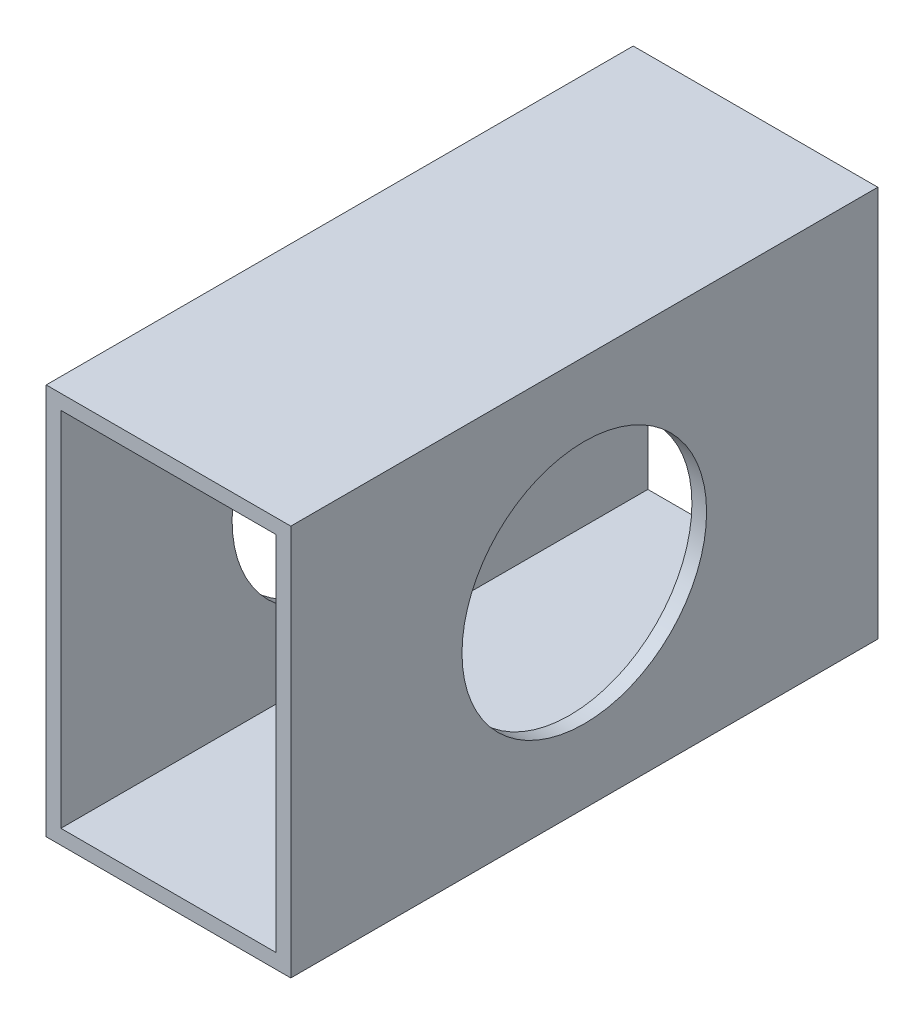
ISO-10303-21;
HEADER;
FILE_DESCRIPTION(('STEP AP214'),'2;1');
FILE_NAME('part.step','',(''),(''),'','','');
FILE_SCHEMA(('AUTOMOTIVE_DESIGN { 1 0 10303 214 1 1 1 1 }'));
ENDSEC;
DATA;
#1=APPLICATION_CONTEXT('core data for automotive mechanical design processes');
#2=APPLICATION_PROTOCOL_DEFINITION('international standard','automotive_design',2000,#1);
#3=PRODUCT_CONTEXT('',#1,'mechanical');
#4=PRODUCT('Part','Part','',(#3));
#5=PRODUCT_RELATED_PRODUCT_CATEGORY('part','',(#4));
#6=PRODUCT_DEFINITION_FORMATION('','',#4);
#7=PRODUCT_DEFINITION_CONTEXT('part definition',#1,'design');
#8=PRODUCT_DEFINITION('design','',#6,#7);
#9=PRODUCT_DEFINITION_SHAPE('','',#8);
#10=(LENGTH_UNIT() NAMED_UNIT(*) SI_UNIT(.MILLI.,.METRE.));
#11=(NAMED_UNIT(*) PLANE_ANGLE_UNIT() SI_UNIT($,.RADIAN.));
#12=(NAMED_UNIT(*) SI_UNIT($,.STERADIAN.) SOLID_ANGLE_UNIT());
#13=UNCERTAINTY_MEASURE_WITH_UNIT(LENGTH_MEASURE(1.E-05),#10,'distance_accuracy_value','');
#14=(GEOMETRIC_REPRESENTATION_CONTEXT(3) GLOBAL_UNCERTAINTY_ASSIGNED_CONTEXT((#13)) GLOBAL_UNIT_ASSIGNED_CONTEXT((#10,
#11,#12)) REPRESENTATION_CONTEXT('',''));
#15=CARTESIAN_POINT('',(0.,0.,0.));
#16=DIRECTION('',(0.,0.,1.));
#17=DIRECTION('',(1.,0.,0.));
#18=AXIS2_PLACEMENT_3D('',#15,#16,#17);
#19=CARTESIAN_POINT('',(0.,0.,120.));
#20=DIRECTION('',(0.,0.,-1.));
#21=DIRECTION('',(-1.,0.,0.));
#22=AXIS2_PLACEMENT_3D('',#19,#20,#21);
#23=PLANE('',#22);
#24=DIRECTION('',(0.,1.,0.));
#25=VECTOR('',#24,1.);
#26=CARTESIAN_POINT('',(25.,-40.,120.));
#27=LINE('',#26,#25);
#28=CARTESIAN_POINT('',(25.,-40.,120.));
#29=VERTEX_POINT('',#28);
#30=CARTESIAN_POINT('',(25.,40.,120.));
#31=VERTEX_POINT('',#30);
#32=EDGE_CURVE('E156',#29,#31,#27,.T.);
#33=ORIENTED_EDGE('',*,*,#32,.T.);
#34=DIRECTION('',(-1.,0.,0.));
#35=VECTOR('',#34,1.);
#36=CARTESIAN_POINT('',(-25.,40.,120.));
#37=LINE('',#36,#35);
#38=CARTESIAN_POINT('',(-25.,40.,120.));
#39=VERTEX_POINT('',#38);
#40=EDGE_CURVE('E160',#31,#39,#37,.T.);
#41=ORIENTED_EDGE('',*,*,#40,.T.);
#42=DIRECTION('',(0.,-1.,0.));
#43=VECTOR('',#42,1.);
#44=CARTESIAN_POINT('',(-25.,-40.,120.));
#45=LINE('',#44,#43);
#46=CARTESIAN_POINT('',(-25.,-40.,120.));
#47=VERTEX_POINT('',#46);
#48=EDGE_CURVE('E164',#39,#47,#45,.T.);
#49=ORIENTED_EDGE('',*,*,#48,.T.);
#50=DIRECTION('',(1.,0.,0.));
#51=VECTOR('',#50,1.);
#52=CARTESIAN_POINT('',(-25.,-40.,120.));
#53=LINE('',#52,#51);
#54=EDGE_CURVE('E167',#47,#29,#53,.T.);
#55=ORIENTED_EDGE('',*,*,#54,.T.);
#56=EDGE_LOOP('',(#33,#41,#49,#55));
#57=FACE_BOUND('',#56,.T.);
#58=DIRECTION('',(0.,1.,0.));
#59=VECTOR('',#58,1.);
#60=CARTESIAN_POINT('',(22.,-37.,120.));
#61=LINE('',#60,#59);
#62=CARTESIAN_POINT('',(22.,-37.,120.));
#63=VERTEX_POINT('',#62);
#64=CARTESIAN_POINT('',(22.,37.,120.));
#65=VERTEX_POINT('',#64);
#66=EDGE_CURVE('E106',#63,#65,#61,.T.);
#67=ORIENTED_EDGE('',*,*,#66,.F.);
#68=DIRECTION('',(1.,0.,0.));
#69=VECTOR('',#68,1.);
#70=CARTESIAN_POINT('',(-22.,-37.,120.));
#71=LINE('',#70,#69);
#72=CARTESIAN_POINT('',(-22.,-37.,120.));
#73=VERTEX_POINT('',#72);
#74=EDGE_CURVE('E132',#73,#63,#71,.T.);
#75=ORIENTED_EDGE('',*,*,#74,.F.);
#76=DIRECTION('',(0.,-1.,0.));
#77=VECTOR('',#76,1.);
#78=CARTESIAN_POINT('',(-22.,-37.,120.));
#79=LINE('',#78,#77);
#80=CARTESIAN_POINT('',(-22.,37.,120.));
#81=VERTEX_POINT('',#80);
#82=EDGE_CURVE('E128',#81,#73,#79,.T.);
#83=ORIENTED_EDGE('',*,*,#82,.F.);
#84=DIRECTION('',(-1.,0.,0.));
#85=VECTOR('',#84,1.);
#86=CARTESIAN_POINT('',(-22.,37.,120.));
#87=LINE('',#86,#85);
#88=EDGE_CURVE('E115',#65,#81,#87,.T.);
#89=ORIENTED_EDGE('',*,*,#88,.F.);
#90=EDGE_LOOP('',(#67,#75,#83,#89));
#91=FACE_BOUND('',#90,.T.);
#92=ADVANCED_FACE('F39',(#57,#91),#23,.F.);
#93=CARTESIAN_POINT('',(0.,0.,0.));
#94=DIRECTION('',(0.,0.,-1.));
#95=DIRECTION('',(-1.,0.,0.));
#96=AXIS2_PLACEMENT_3D('',#93,#94,#95);
#97=PLANE('',#96);
#98=DIRECTION('',(0.,1.,0.));
#99=VECTOR('',#98,1.);
#100=CARTESIAN_POINT('',(25.,-40.,0.));
#101=LINE('',#100,#99);
#102=CARTESIAN_POINT('',(25.,-40.,0.));
#103=VERTEX_POINT('',#102);
#104=CARTESIAN_POINT('',(25.,40.,0.));
#105=VERTEX_POINT('',#104);
#106=EDGE_CURVE('E124',#103,#105,#101,.T.);
#107=ORIENTED_EDGE('',*,*,#106,.F.);
#108=DIRECTION('',(1.,0.,0.));
#109=VECTOR('',#108,1.);
#110=CARTESIAN_POINT('',(-25.,-40.,0.));
#111=LINE('',#110,#109);
#112=CARTESIAN_POINT('',(-25.,-40.,0.));
#113=VERTEX_POINT('',#112);
#114=EDGE_CURVE('E161',#113,#103,#111,.T.);
#115=ORIENTED_EDGE('',*,*,#114,.F.);
#116=DIRECTION('',(0.,-1.,0.));
#117=VECTOR('',#116,1.);
#118=CARTESIAN_POINT('',(-25.,-40.,0.));
#119=LINE('',#118,#117);
#120=CARTESIAN_POINT('',(-25.,40.,0.));
#121=VERTEX_POINT('',#120);
#122=EDGE_CURVE('E177',#121,#113,#119,.T.);
#123=ORIENTED_EDGE('',*,*,#122,.F.);
#124=DIRECTION('',(-1.,0.,0.));
#125=VECTOR('',#124,1.);
#126=CARTESIAN_POINT('',(-25.,40.,0.));
#127=LINE('',#126,#125);
#128=EDGE_CURVE('E174',#105,#121,#127,.T.);
#129=ORIENTED_EDGE('',*,*,#128,.F.);
#130=EDGE_LOOP('',(#107,#115,#123,#129));
#131=FACE_BOUND('',#130,.T.);
#132=DIRECTION('',(1.,0.,0.));
#133=VECTOR('',#132,1.);
#134=CARTESIAN_POINT('',(-22.,-37.,0.));
#135=LINE('',#134,#133);
#136=CARTESIAN_POINT('',(-22.,-37.,0.));
#137=VERTEX_POINT('',#136);
#138=CARTESIAN_POINT('',(22.,-37.,0.));
#139=VERTEX_POINT('',#138);
#140=EDGE_CURVE('E116',#137,#139,#135,.T.);
#141=ORIENTED_EDGE('',*,*,#140,.T.);
#142=DIRECTION('',(0.,1.,0.));
#143=VECTOR('',#142,1.);
#144=CARTESIAN_POINT('',(22.,-37.,0.));
#145=LINE('',#144,#143);
#146=CARTESIAN_POINT('',(22.,37.,0.));
#147=VERTEX_POINT('',#146);
#148=EDGE_CURVE('E64',#139,#147,#145,.T.);
#149=ORIENTED_EDGE('',*,*,#148,.T.);
#150=DIRECTION('',(-1.,0.,0.));
#151=VECTOR('',#150,1.);
#152=CARTESIAN_POINT('',(-22.,37.,0.));
#153=LINE('',#152,#151);
#154=CARTESIAN_POINT('',(-22.,37.,0.));
#155=VERTEX_POINT('',#154);
#156=EDGE_CURVE('E122',#147,#155,#153,.T.);
#157=ORIENTED_EDGE('',*,*,#156,.T.);
#158=DIRECTION('',(0.,-1.,0.));
#159=VECTOR('',#158,1.);
#160=CARTESIAN_POINT('',(-22.,-37.,0.));
#161=LINE('',#160,#159);
#162=EDGE_CURVE('E143',#155,#137,#161,.T.);
#163=ORIENTED_EDGE('',*,*,#162,.T.);
#164=EDGE_LOOP('',(#141,#149,#157,#163));
#165=FACE_BOUND('',#164,.T.);
#166=ADVANCED_FACE('F201',(#131,#165),#97,.T.);
#167=CARTESIAN_POINT('',(25.,-40.,120.));
#168=DIRECTION('',(-1.,0.,0.));
#169=DIRECTION('',(0.,0.,1.));
#170=AXIS2_PLACEMENT_3D('',#167,#168,#169);
#171=PLANE('',#170);
#172=CARTESIAN_POINT('',(25.,0.,60.));
#173=DIRECTION('',(1.,0.,0.));
#174=DIRECTION('',(0.,0.,-1.));
#175=AXIS2_PLACEMENT_3D('',#172,#173,#174);
#176=CIRCLE('',#175,25.);
#177=CARTESIAN_POINT('',(25.,0.,35.));
#178=VERTEX_POINT('',#177);
#179=EDGE_CURVE('E246',#178,#178,#176,.T.);
#180=ORIENTED_EDGE('',*,*,#179,.F.);
#181=EDGE_LOOP('',(#180));
#182=FACE_BOUND('',#181,.T.);
#183=ORIENTED_EDGE('',*,*,#106,.T.);
#184=DIRECTION('',(0.,0.,-1.));
#185=VECTOR('',#184,1.);
#186=CARTESIAN_POINT('',(25.,40.,120.));
#187=LINE('',#186,#185);
#188=EDGE_CURVE('E11',#31,#105,#187,.T.);
#189=ORIENTED_EDGE('',*,*,#188,.F.);
#190=ORIENTED_EDGE('',*,*,#32,.F.);
#191=DIRECTION('',(0.,0.,-1.));
#192=VECTOR('',#191,1.);
#193=CARTESIAN_POINT('',(25.,-40.,120.));
#194=LINE('',#193,#192);
#195=EDGE_CURVE('E170',#29,#103,#194,.T.);
#196=ORIENTED_EDGE('',*,*,#195,.T.);
#197=EDGE_LOOP('',(#183,#189,#190,#196));
#198=FACE_BOUND('',#197,.T.);
#199=ADVANCED_FACE('F41',(#182,#198),#171,.F.);
#200=CARTESIAN_POINT('',(-25.,40.,120.));
#201=DIRECTION('',(0.,-1.,0.));
#202=DIRECTION('',(0.,0.,-1.));
#203=AXIS2_PLACEMENT_3D('',#200,#201,#202);
#204=PLANE('',#203);
#205=ORIENTED_EDGE('',*,*,#128,.T.);
#206=DIRECTION('',(0.,0.,-1.));
#207=VECTOR('',#206,1.);
#208=CARTESIAN_POINT('',(-25.,40.,120.));
#209=LINE('',#208,#207);
#210=EDGE_CURVE('E49',#39,#121,#209,.T.);
#211=ORIENTED_EDGE('',*,*,#210,.F.);
#212=ORIENTED_EDGE('',*,*,#40,.F.);
#213=ORIENTED_EDGE('',*,*,#188,.T.);
#214=EDGE_LOOP('',(#205,#211,#212,#213));
#215=FACE_BOUND('',#214,.T.);
#216=ADVANCED_FACE('F211',(#215),#204,.F.);
#217=CARTESIAN_POINT('',(-25.,-40.,120.));
#218=DIRECTION('',(1.,0.,0.));
#219=DIRECTION('',(0.,0.,-1.));
#220=AXIS2_PLACEMENT_3D('',#217,#218,#219);
#221=PLANE('',#220);
#222=CARTESIAN_POINT('',(-25.,0.,60.));
#223=DIRECTION('',(1.,0.,0.));
#224=DIRECTION('',(0.,0.,-1.));
#225=AXIS2_PLACEMENT_3D('',#222,#223,#224);
#226=CIRCLE('',#225,25.);
#227=CARTESIAN_POINT('',(-25.,0.,35.));
#228=VERTEX_POINT('',#227);
#229=EDGE_CURVE('E244',#228,#228,#226,.T.);
#230=ORIENTED_EDGE('',*,*,#229,.T.);
#231=EDGE_LOOP('',(#230));
#232=FACE_BOUND('',#231,.T.);
#233=ORIENTED_EDGE('',*,*,#122,.T.);
#234=DIRECTION('',(0.,0.,-1.));
#235=VECTOR('',#234,1.);
#236=CARTESIAN_POINT('',(-25.,-40.,120.));
#237=LINE('',#236,#235);
#238=EDGE_CURVE('E185',#47,#113,#237,.T.);
#239=ORIENTED_EDGE('',*,*,#238,.F.);
#240=ORIENTED_EDGE('',*,*,#48,.F.);
#241=ORIENTED_EDGE('',*,*,#210,.T.);
#242=EDGE_LOOP('',(#233,#239,#240,#241));
#243=FACE_BOUND('',#242,.T.);
#244=ADVANCED_FACE('F195',(#232,#243),#221,.F.);
#245=CARTESIAN_POINT('',(-25.,-40.,120.));
#246=DIRECTION('',(0.,1.,0.));
#247=DIRECTION('',(0.,0.,1.));
#248=AXIS2_PLACEMENT_3D('',#245,#246,#247);
#249=PLANE('',#248);
#250=ORIENTED_EDGE('',*,*,#114,.T.);
#251=ORIENTED_EDGE('',*,*,#195,.F.);
#252=ORIENTED_EDGE('',*,*,#54,.F.);
#253=ORIENTED_EDGE('',*,*,#238,.T.);
#254=EDGE_LOOP('',(#250,#251,#252,#253));
#255=FACE_BOUND('',#254,.T.);
#256=ADVANCED_FACE('F205',(#255),#249,.F.);
#257=CARTESIAN_POINT('',(22.,-37.,120.));
#258=DIRECTION('',(-1.,0.,0.));
#259=DIRECTION('',(0.,0.,1.));
#260=AXIS2_PLACEMENT_3D('',#257,#258,#259);
#261=PLANE('',#260);
#262=CARTESIAN_POINT('',(22.,0.,60.));
#263=DIRECTION('',(-1.,0.,0.));
#264=DIRECTION('',(0.,0.,1.));
#265=AXIS2_PLACEMENT_3D('',#262,#263,#264);
#266=CIRCLE('',#265,25.);
#267=CARTESIAN_POINT('',(22.,0.,85.));
#268=VERTEX_POINT('',#267);
#269=EDGE_CURVE('E140',#268,#268,#266,.T.);
#270=ORIENTED_EDGE('',*,*,#269,.F.);
#271=EDGE_LOOP('',(#270));
#272=FACE_BOUND('',#271,.T.);
#273=ORIENTED_EDGE('',*,*,#148,.F.);
#274=DIRECTION('',(0.,0.,-1.));
#275=VECTOR('',#274,1.);
#276=CARTESIAN_POINT('',(22.,-37.,120.));
#277=LINE('',#276,#275);
#278=EDGE_CURVE('E110',#63,#139,#277,.T.);
#279=ORIENTED_EDGE('',*,*,#278,.F.);
#280=ORIENTED_EDGE('',*,*,#66,.T.);
#281=DIRECTION('',(0.,0.,-1.));
#282=VECTOR('',#281,1.);
#283=CARTESIAN_POINT('',(22.,37.,120.));
#284=LINE('',#283,#282);
#285=EDGE_CURVE('E109',#65,#147,#284,.T.);
#286=ORIENTED_EDGE('',*,*,#285,.T.);
#287=EDGE_LOOP('',(#273,#279,#280,#286));
#288=FACE_BOUND('',#287,.T.);
#289=ADVANCED_FACE('F108',(#272,#288),#261,.T.);
#290=CARTESIAN_POINT('',(-22.,37.,120.));
#291=DIRECTION('',(0.,-1.,0.));
#292=DIRECTION('',(0.,0.,-1.));
#293=AXIS2_PLACEMENT_3D('',#290,#291,#292);
#294=PLANE('',#293);
#295=ORIENTED_EDGE('',*,*,#156,.F.);
#296=ORIENTED_EDGE('',*,*,#285,.F.);
#297=ORIENTED_EDGE('',*,*,#88,.T.);
#298=DIRECTION('',(0.,0.,-1.));
#299=VECTOR('',#298,1.);
#300=CARTESIAN_POINT('',(-22.,37.,120.));
#301=LINE('',#300,#299);
#302=EDGE_CURVE('E125',#81,#155,#301,.T.);
#303=ORIENTED_EDGE('',*,*,#302,.T.);
#304=EDGE_LOOP('',(#295,#296,#297,#303));
#305=FACE_BOUND('',#304,.T.);
#306=ADVANCED_FACE('F119',(#305),#294,.T.);
#307=CARTESIAN_POINT('',(-22.,-37.,120.));
#308=DIRECTION('',(1.,0.,0.));
#309=DIRECTION('',(0.,0.,-1.));
#310=AXIS2_PLACEMENT_3D('',#307,#308,#309);
#311=PLANE('',#310);
#312=CARTESIAN_POINT('',(-22.,0.,60.));
#313=DIRECTION('',(1.,0.,0.));
#314=DIRECTION('',(0.,0.,-1.));
#315=AXIS2_PLACEMENT_3D('',#312,#313,#314);
#316=CIRCLE('',#315,25.);
#317=CARTESIAN_POINT('',(-22.,0.,35.));
#318=VERTEX_POINT('',#317);
#319=EDGE_CURVE('E43',#318,#318,#316,.T.);
#320=ORIENTED_EDGE('',*,*,#319,.F.);
#321=EDGE_LOOP('',(#320));
#322=FACE_BOUND('',#321,.T.);
#323=ORIENTED_EDGE('',*,*,#162,.F.);
#324=ORIENTED_EDGE('',*,*,#302,.F.);
#325=ORIENTED_EDGE('',*,*,#82,.T.);
#326=DIRECTION('',(0.,0.,-1.));
#327=VECTOR('',#326,1.);
#328=CARTESIAN_POINT('',(-22.,-37.,120.));
#329=LINE('',#328,#327);
#330=EDGE_CURVE('E56',#73,#137,#329,.T.);
#331=ORIENTED_EDGE('',*,*,#330,.T.);
#332=EDGE_LOOP('',(#323,#324,#325,#331));
#333=FACE_BOUND('',#332,.T.);
#334=ADVANCED_FACE('F237',(#322,#333),#311,.T.);
#335=CARTESIAN_POINT('',(-22.,-37.,120.));
#336=DIRECTION('',(0.,1.,0.));
#337=DIRECTION('',(0.,0.,1.));
#338=AXIS2_PLACEMENT_3D('',#335,#336,#337);
#339=PLANE('',#338);
#340=ORIENTED_EDGE('',*,*,#140,.F.);
#341=ORIENTED_EDGE('',*,*,#330,.F.);
#342=ORIENTED_EDGE('',*,*,#74,.T.);
#343=ORIENTED_EDGE('',*,*,#278,.T.);
#344=EDGE_LOOP('',(#340,#341,#342,#343));
#345=FACE_BOUND('',#344,.T.);
#346=ADVANCED_FACE('F257',(#345),#339,.T.);
#347=CARTESIAN_POINT('',(-25.,0.,60.));
#348=DIRECTION('',(1.,0.,0.));
#349=DIRECTION('',(0.,0.,-1.));
#350=AXIS2_PLACEMENT_3D('',#347,#348,#349);
#351=CYLINDRICAL_SURFACE('',#350,25.);
#352=ORIENTED_EDGE('',*,*,#319,.T.);
#353=EDGE_LOOP('',(#352));
#354=FACE_BOUND('',#353,.T.);
#355=ORIENTED_EDGE('',*,*,#229,.F.);
#356=EDGE_LOOP('',(#355));
#357=FACE_BOUND('',#356,.T.);
#358=ADVANCED_FACE('F254',(#354,#357),#351,.F.);
#359=ORIENTED_EDGE('',*,*,#269,.T.);
#360=EDGE_LOOP('',(#359));
#361=FACE_BOUND('',#360,.T.);
#362=ORIENTED_EDGE('',*,*,#179,.T.);
#363=EDGE_LOOP('',(#362));
#364=FACE_BOUND('',#363,.T.);
#365=ADVANCED_FACE('F256',(#361,#364),#351,.F.);
#366=CLOSED_SHELL('',(#92,#166,#199,#216,#244,#256,#289,#306,#334,#346,#358,#365));
#367=MANIFOLD_SOLID_BREP('B2',#366);
#368=ADVANCED_BREP_SHAPE_REPRESENTATION('',(#18,#367),#14);
#369=SHAPE_DEFINITION_REPRESENTATION(#9,#368);
ENDSEC;
END-ISO-10303-21;
